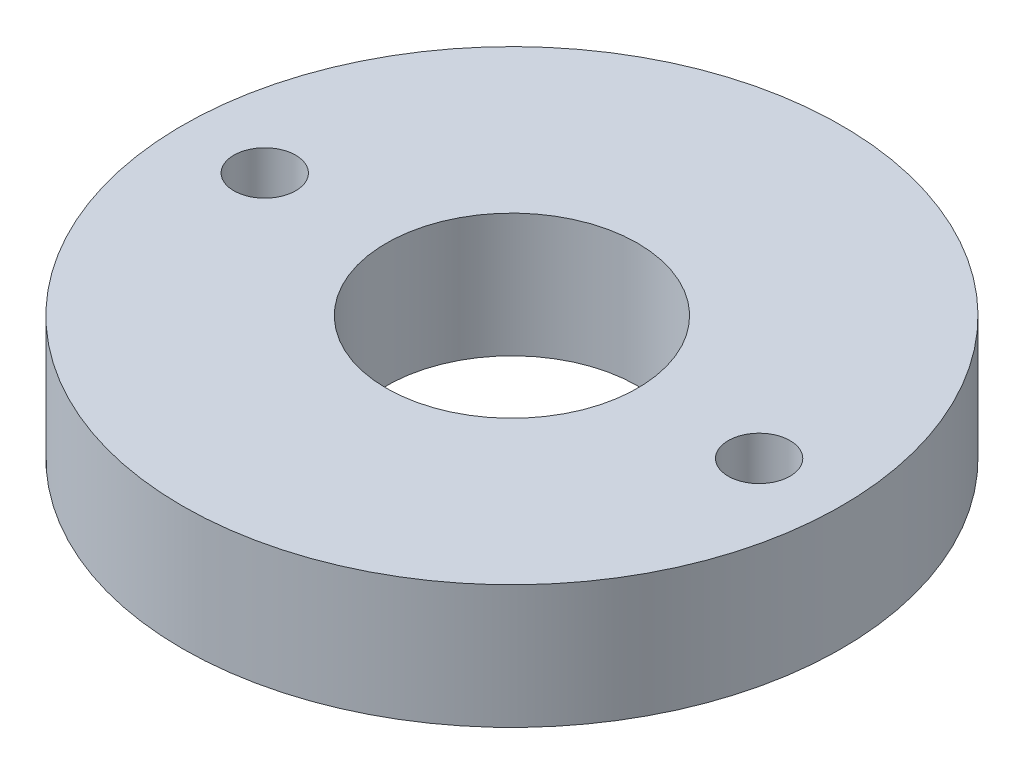
ISO-10303-21;
HEADER;
FILE_DESCRIPTION(('STEP AP214'),'2;1');
FILE_NAME('part.step','',(''),(''),'','','');
FILE_SCHEMA(('AUTOMOTIVE_DESIGN { 1 0 10303 214 1 1 1 1 }'));
ENDSEC;
DATA;
#1=APPLICATION_CONTEXT('core data for automotive mechanical design processes');
#2=APPLICATION_PROTOCOL_DEFINITION('international standard','automotive_design',2000,#1);
#3=PRODUCT_CONTEXT('',#1,'mechanical');
#4=PRODUCT('Part','Part','',(#3));
#5=PRODUCT_RELATED_PRODUCT_CATEGORY('part','',(#4));
#6=PRODUCT_DEFINITION_FORMATION('','',#4);
#7=PRODUCT_DEFINITION_CONTEXT('part definition',#1,'design');
#8=PRODUCT_DEFINITION('design','',#6,#7);
#9=PRODUCT_DEFINITION_SHAPE('','',#8);
#10=(LENGTH_UNIT() NAMED_UNIT(*) SI_UNIT(.MILLI.,.METRE.));
#11=(NAMED_UNIT(*) PLANE_ANGLE_UNIT() SI_UNIT($,.RADIAN.));
#12=(NAMED_UNIT(*) SI_UNIT($,.STERADIAN.) SOLID_ANGLE_UNIT());
#13=UNCERTAINTY_MEASURE_WITH_UNIT(LENGTH_MEASURE(1.E-05),#10,'distance_accuracy_value','');
#14=(GEOMETRIC_REPRESENTATION_CONTEXT(3) GLOBAL_UNCERTAINTY_ASSIGNED_CONTEXT((#13)) GLOBAL_UNIT_ASSIGNED_CONTEXT((#10,
#11,#12)) REPRESENTATION_CONTEXT('',''));
#15=CARTESIAN_POINT('',(0.,0.,0.));
#16=DIRECTION('',(0.,0.,1.));
#17=DIRECTION('',(1.,0.,0.));
#18=AXIS2_PLACEMENT_3D('',#15,#16,#17);
#19=CARTESIAN_POINT('',(0.,6.,0.));
#20=DIRECTION('',(0.,1.,0.));
#21=DIRECTION('',(0.,0.,1.));
#22=AXIS2_PLACEMENT_3D('',#19,#20,#21);
#23=PLANE('',#22);
#24=CARTESIAN_POINT('',(12.,6.,0.));
#25=DIRECTION('',(0.,1.,0.));
#26=DIRECTION('',(0.,0.,1.));
#27=AXIS2_PLACEMENT_3D('',#24,#25,#26);
#28=CIRCLE('',#27,1.5);
#29=CARTESIAN_POINT('',(12.,6.,1.5));
#30=VERTEX_POINT('',#29);
#31=EDGE_CURVE('E56',#30,#30,#28,.T.);
#32=ORIENTED_EDGE('',*,*,#31,.F.);
#33=EDGE_LOOP('',(#32));
#34=FACE_BOUND('',#33,.T.);
#35=CARTESIAN_POINT('',(0.,6.,0.));
#36=DIRECTION('',(0.,1.,0.));
#37=DIRECTION('',(0.,0.,1.));
#38=AXIS2_PLACEMENT_3D('',#35,#36,#37);
#39=CIRCLE('',#38,16.);
#40=CARTESIAN_POINT('',(0.,6.,16.));
#41=VERTEX_POINT('',#40);
#42=EDGE_CURVE('E10',#41,#41,#39,.T.);
#43=ORIENTED_EDGE('',*,*,#42,.T.);
#44=EDGE_LOOP('',(#43));
#45=FACE_BOUND('',#44,.T.);
#46=CARTESIAN_POINT('',(0.,6.,0.));
#47=DIRECTION('',(0.,1.,0.));
#48=DIRECTION('',(0.,0.,1.));
#49=AXIS2_PLACEMENT_3D('',#46,#47,#48);
#50=CIRCLE('',#49,6.1);
#51=CARTESIAN_POINT('',(0.,6.,6.1));
#52=VERTEX_POINT('',#51);
#53=EDGE_CURVE('E50',#52,#52,#50,.T.);
#54=ORIENTED_EDGE('',*,*,#53,.F.);
#55=EDGE_LOOP('',(#54));
#56=FACE_BOUND('',#55,.T.);
#57=CARTESIAN_POINT('',(-12.,6.,0.));
#58=DIRECTION('',(0.,1.,0.));
#59=DIRECTION('',(0.,0.,-1.));
#60=AXIS2_PLACEMENT_3D('',#57,#58,#59);
#61=CIRCLE('',#60,1.5);
#62=CARTESIAN_POINT('',(-12.,6.,-1.5));
#63=VERTEX_POINT('',#62);
#64=EDGE_CURVE('E64',#63,#63,#61,.T.);
#65=ORIENTED_EDGE('',*,*,#64,.F.);
#66=EDGE_LOOP('',(#65));
#67=FACE_BOUND('',#66,.T.);
#68=ADVANCED_FACE('F37',(#34,#45,#56,#67),#23,.T.);
#69=CARTESIAN_POINT('',(0.,0.,0.));
#70=DIRECTION('',(0.,1.,0.));
#71=DIRECTION('',(0.,0.,1.));
#72=AXIS2_PLACEMENT_3D('',#69,#70,#71);
#73=PLANE('',#72);
#74=CARTESIAN_POINT('',(0.,0.,0.));
#75=DIRECTION('',(0.,1.,0.));
#76=DIRECTION('',(0.,0.,1.));
#77=AXIS2_PLACEMENT_3D('',#74,#75,#76);
#78=CIRCLE('',#77,16.);
#79=CARTESIAN_POINT('',(0.,0.,16.));
#80=VERTEX_POINT('',#79);
#81=EDGE_CURVE('E41',#80,#80,#78,.T.);
#82=ORIENTED_EDGE('',*,*,#81,.F.);
#83=EDGE_LOOP('',(#82));
#84=FACE_BOUND('',#83,.T.);
#85=CARTESIAN_POINT('',(0.,0.,0.));
#86=DIRECTION('',(0.,1.,0.));
#87=DIRECTION('',(0.,0.,1.));
#88=AXIS2_PLACEMENT_3D('',#85,#86,#87);
#89=CIRCLE('',#88,6.1);
#90=CARTESIAN_POINT('',(0.,0.,6.1));
#91=VERTEX_POINT('',#90);
#92=EDGE_CURVE('E52',#91,#91,#89,.T.);
#93=ORIENTED_EDGE('',*,*,#92,.T.);
#94=EDGE_LOOP('',(#93));
#95=FACE_BOUND('',#94,.T.);
#96=CARTESIAN_POINT('',(12.,0.,0.));
#97=DIRECTION('',(0.,1.,0.));
#98=DIRECTION('',(0.,0.,1.));
#99=AXIS2_PLACEMENT_3D('',#96,#97,#98);
#100=CIRCLE('',#99,1.5);
#101=CARTESIAN_POINT('',(12.,0.,1.5));
#102=VERTEX_POINT('',#101);
#103=EDGE_CURVE('E60',#102,#102,#100,.T.);
#104=ORIENTED_EDGE('',*,*,#103,.T.);
#105=EDGE_LOOP('',(#104));
#106=FACE_BOUND('',#105,.T.);
#107=CARTESIAN_POINT('',(-12.,0.,0.));
#108=DIRECTION('',(0.,1.,0.));
#109=DIRECTION('',(0.,0.,-1.));
#110=AXIS2_PLACEMENT_3D('',#107,#108,#109);
#111=CIRCLE('',#110,1.5);
#112=CARTESIAN_POINT('',(-12.,0.,-1.5));
#113=VERTEX_POINT('',#112);
#114=EDGE_CURVE('E68',#113,#113,#111,.T.);
#115=ORIENTED_EDGE('',*,*,#114,.T.);
#116=EDGE_LOOP('',(#115));
#117=FACE_BOUND('',#116,.T.);
#118=ADVANCED_FACE('F80',(#84,#95,#106,#117),#73,.F.);
#119=CARTESIAN_POINT('',(0.,6.,0.));
#120=DIRECTION('',(0.,-1.,0.));
#121=DIRECTION('',(0.,0.,-1.));
#122=AXIS2_PLACEMENT_3D('',#119,#120,#121);
#123=CYLINDRICAL_SURFACE('',#122,16.);
#124=ORIENTED_EDGE('',*,*,#42,.F.);
#125=EDGE_LOOP('',(#124));
#126=FACE_BOUND('',#125,.T.);
#127=ORIENTED_EDGE('',*,*,#81,.T.);
#128=EDGE_LOOP('',(#127));
#129=FACE_BOUND('',#128,.T.);
#130=ADVANCED_FACE('F39',(#126,#129),#123,.T.);
#131=CARTESIAN_POINT('',(0.,6.,0.));
#132=DIRECTION('',(0.,-1.,0.));
#133=DIRECTION('',(0.,0.,-1.));
#134=AXIS2_PLACEMENT_3D('',#131,#132,#133);
#135=CYLINDRICAL_SURFACE('',#134,6.1);
#136=ORIENTED_EDGE('',*,*,#53,.T.);
#137=EDGE_LOOP('',(#136));
#138=FACE_BOUND('',#137,.T.);
#139=ORIENTED_EDGE('',*,*,#92,.F.);
#140=EDGE_LOOP('',(#139));
#141=FACE_BOUND('',#140,.T.);
#142=ADVANCED_FACE('F89',(#138,#141),#135,.F.);
#143=CARTESIAN_POINT('',(12.,6.,0.));
#144=DIRECTION('',(0.,-1.,0.));
#145=DIRECTION('',(0.,0.,-1.));
#146=AXIS2_PLACEMENT_3D('',#143,#144,#145);
#147=CYLINDRICAL_SURFACE('',#146,1.5);
#148=ORIENTED_EDGE('',*,*,#31,.T.);
#149=EDGE_LOOP('',(#148));
#150=FACE_BOUND('',#149,.T.);
#151=ORIENTED_EDGE('',*,*,#103,.F.);
#152=EDGE_LOOP('',(#151));
#153=FACE_BOUND('',#152,.T.);
#154=ADVANCED_FACE('F92',(#150,#153),#147,.F.);
#155=CARTESIAN_POINT('',(-12.,6.,0.));
#156=DIRECTION('',(0.,-1.,0.));
#157=DIRECTION('',(0.,0.,-1.));
#158=AXIS2_PLACEMENT_3D('',#155,#156,#157);
#159=CYLINDRICAL_SURFACE('',#158,1.5);
#160=ORIENTED_EDGE('',*,*,#64,.T.);
#161=EDGE_LOOP('',(#160));
#162=FACE_BOUND('',#161,.T.);
#163=ORIENTED_EDGE('',*,*,#114,.F.);
#164=EDGE_LOOP('',(#163));
#165=FACE_BOUND('',#164,.T.);
#166=ADVANCED_FACE('F76',(#162,#165),#159,.F.);
#167=CLOSED_SHELL('',(#68,#118,#130,#142,#154,#166));
#168=MANIFOLD_SOLID_BREP('B2',#167);
#169=ADVANCED_BREP_SHAPE_REPRESENTATION('',(#18,#168),#14);
#170=SHAPE_DEFINITION_REPRESENTATION(#9,#169);
ENDSEC;
END-ISO-10303-21;
